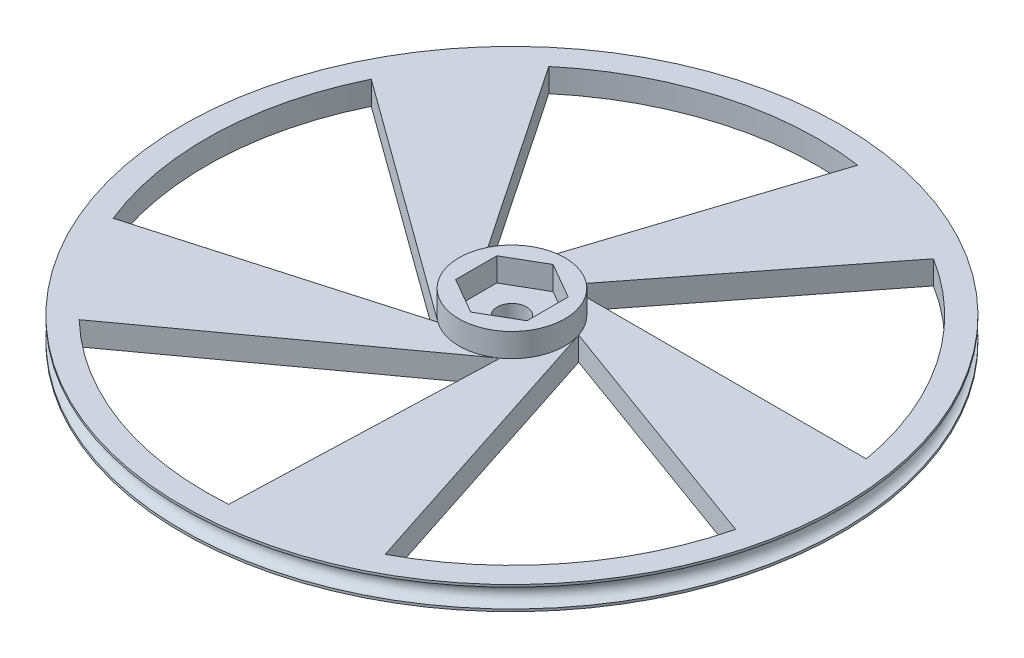
ISO-10303-21;
HEADER;
FILE_DESCRIPTION(('STEP AP214'),'2;1');
FILE_NAME('part.step','',(''),(''),'','','');
FILE_SCHEMA(('AUTOMOTIVE_DESIGN { 1 0 10303 214 1 1 1 1 }'));
ENDSEC;
DATA;
#1=APPLICATION_CONTEXT('core data for automotive mechanical design processes');
#2=APPLICATION_PROTOCOL_DEFINITION('international standard','automotive_design',2000,#1);
#3=PRODUCT_CONTEXT('',#1,'mechanical');
#4=PRODUCT('Part','Part','',(#3));
#5=PRODUCT_RELATED_PRODUCT_CATEGORY('part','',(#4));
#6=PRODUCT_DEFINITION_FORMATION('','',#4);
#7=PRODUCT_DEFINITION_CONTEXT('part definition',#1,'design');
#8=PRODUCT_DEFINITION('design','',#6,#7);
#9=PRODUCT_DEFINITION_SHAPE('','',#8);
#10=(LENGTH_UNIT() NAMED_UNIT(*) SI_UNIT(.MILLI.,.METRE.));
#11=(NAMED_UNIT(*) PLANE_ANGLE_UNIT() SI_UNIT($,.RADIAN.));
#12=(NAMED_UNIT(*) SI_UNIT($,.STERADIAN.) SOLID_ANGLE_UNIT());
#13=UNCERTAINTY_MEASURE_WITH_UNIT(LENGTH_MEASURE(1.E-05),#10,'distance_accuracy_value','');
#14=(GEOMETRIC_REPRESENTATION_CONTEXT(3) GLOBAL_UNCERTAINTY_ASSIGNED_CONTEXT((#13)) GLOBAL_UNIT_ASSIGNED_CONTEXT((#10,
#11,#12)) REPRESENTATION_CONTEXT('',''));
#15=CARTESIAN_POINT('',(0.,0.,0.));
#16=DIRECTION('',(0.,0.,1.));
#17=DIRECTION('',(1.,0.,0.));
#18=AXIS2_PLACEMENT_3D('',#15,#16,#17);
#19=CARTESIAN_POINT('',(0.,4.,0.));
#20=DIRECTION('',(0.,-1.,0.));
#21=DIRECTION('',(0.,0.,-1.));
#22=AXIS2_PLACEMENT_3D('',#19,#20,#21);
#23=CYLINDRICAL_SURFACE('',#22,2.5);
#24=CARTESIAN_POINT('',(0.,0.,0.));
#25=DIRECTION('',(0.,-1.,0.));
#26=DIRECTION('',(0.,0.,-1.));
#27=AXIS2_PLACEMENT_3D('',#24,#25,#26);
#28=CIRCLE('',#27,2.5);
#29=CARTESIAN_POINT('',(0.,0.,-2.5));
#30=VERTEX_POINT('',#29);
#31=EDGE_CURVE('E412',#30,#30,#28,.T.);
#32=ORIENTED_EDGE('',*,*,#31,.T.);
#33=EDGE_LOOP('',(#32));
#34=FACE_BOUND('',#33,.T.);
#35=CARTESIAN_POINT('',(0.,4.,0.));
#36=DIRECTION('',(0.,1.,0.));
#37=DIRECTION('',(0.,0.,1.));
#38=AXIS2_PLACEMENT_3D('',#35,#36,#37);
#39=CIRCLE('',#38,2.5);
#40=CARTESIAN_POINT('',(0.,4.,2.5));
#41=VERTEX_POINT('',#40);
#42=EDGE_CURVE('E93',#41,#41,#39,.T.);
#43=ORIENTED_EDGE('',*,*,#42,.T.);
#44=EDGE_LOOP('',(#43));
#45=FACE_BOUND('',#44,.T.);
#46=ADVANCED_FACE('F89',(#34,#45),#23,.F.);
#47=CARTESIAN_POINT('',(0.,2.,0.));
#48=DIRECTION('',(0.,-1.,0.));
#49=DIRECTION('',(0.,0.,-1.));
#50=AXIS2_PLACEMENT_3D('',#47,#48,#49);
#51=TOROIDAL_SURFACE('',#50,56.,1.6);
#52=CARTESIAN_POINT('',(0.,0.400000000000002,0.));
#53=DIRECTION('',(0.,-1.,0.));
#54=DIRECTION('',(0.,0.,-1.));
#55=AXIS2_PLACEMENT_3D('',#52,#53,#54);
#56=CIRCLE('',#55,56.);
#57=CARTESIAN_POINT('',(0.,0.400000000000002,-56.));
#58=VERTEX_POINT('',#57);
#59=EDGE_CURVE('E402',#58,#58,#56,.T.);
#60=ORIENTED_EDGE('',*,*,#59,.F.);
#61=EDGE_LOOP('',(#60));
#62=FACE_BOUND('',#61,.T.);
#63=CARTESIAN_POINT('',(0.,3.6,0.));
#64=DIRECTION('',(0.,-1.,0.));
#65=DIRECTION('',(0.,0.,-1.));
#66=AXIS2_PLACEMENT_3D('',#63,#64,#65);
#67=CIRCLE('',#66,56.);
#68=CARTESIAN_POINT('',(0.,3.6,-56.));
#69=VERTEX_POINT('',#68);
#70=EDGE_CURVE('E12',#69,#69,#67,.T.);
#71=ORIENTED_EDGE('',*,*,#70,.T.);
#72=EDGE_LOOP('',(#71));
#73=FACE_BOUND('',#72,.T.);
#74=ADVANCED_FACE('F91',(#62,#73),#51,.F.);
#75=CARTESIAN_POINT('',(0.,4.,0.));
#76=DIRECTION('',(0.,-1.,0.));
#77=DIRECTION('',(0.,0.,-1.));
#78=AXIS2_PLACEMENT_3D('',#75,#76,#77);
#79=CYLINDRICAL_SURFACE('',#78,56.);
#80=CARTESIAN_POINT('',(0.,4.,0.));
#81=DIRECTION('',(0.,-1.,0.));
#82=DIRECTION('',(0.,0.,-1.));
#83=AXIS2_PLACEMENT_3D('',#80,#81,#82);
#84=CIRCLE('',#83,56.);
#85=CARTESIAN_POINT('',(0.,4.,-56.));
#86=VERTEX_POINT('',#85);
#87=EDGE_CURVE('E98',#86,#86,#84,.T.);
#88=ORIENTED_EDGE('',*,*,#87,.T.);
#89=EDGE_LOOP('',(#88));
#90=FACE_BOUND('',#89,.T.);
#91=ORIENTED_EDGE('',*,*,#70,.F.);
#92=EDGE_LOOP('',(#91));
#93=FACE_BOUND('',#92,.T.);
#94=ADVANCED_FACE('F426',(#90,#93),#79,.T.);
#95=CARTESIAN_POINT('',(0.,4.,0.));
#96=DIRECTION('',(0.,-1.,0.));
#97=DIRECTION('',(0.,0.,-1.));
#98=AXIS2_PLACEMENT_3D('',#95,#96,#97);
#99=PLANE('',#98);
#100=CARTESIAN_POINT('',(0.,4.,0.));
#101=DIRECTION('',(0.,1.,0.));
#102=DIRECTION('',(0.,0.,1.));
#103=AXIS2_PLACEMENT_3D('',#100,#101,#102);
#104=CIRCLE('',#103,52.);
#105=CARTESIAN_POINT('',(51.2152321092075,4.,-9.));
#106=VERTEX_POINT('',#105);
#107=CARTESIAN_POINT('',(27.4657957441155,4.,-44.1546154342049));
#108=VERTEX_POINT('',#107);
#109=EDGE_CURVE('E299',#106,#108,#104,.T.);
#110=ORIENTED_EDGE('',*,*,#109,.F.);
#111=DIRECTION('',(1.,0.,0.));
#112=VECTOR('',#111,1.);
#113=CARTESIAN_POINT('',(0.,4.,-9.));
#114=LINE('',#113,#112);
#115=CARTESIAN_POINT('',(0.,4.,-9.));
#116=VERTEX_POINT('',#115);
#117=EDGE_CURVE('E113',#116,#106,#114,.T.);
#118=ORIENTED_EDGE('',*,*,#117,.F.);
#119=CARTESIAN_POINT('',(0.,4.,0.));
#120=DIRECTION('',(0.,-1.,0.));
#121=DIRECTION('',(0.,0.,-1.));
#122=AXIS2_PLACEMENT_3D('',#119,#120,#121);
#123=CIRCLE('',#122,9.);
#124=CARTESIAN_POINT('',(8.55950864665637,4.,-2.78115294937457));
#125=VERTEX_POINT('',#124);
#126=EDGE_CURVE('E418',#116,#125,#123,.T.);
#127=ORIENTED_EDGE('',*,*,#126,.T.);
#128=DIRECTION('',(0.939692620785908,0.,0.342020143325669));
#129=VECTOR('',#128,1.);
#130=CARTESIAN_POINT('',(1.89511763427878,4.,-5.20679290739121));
#131=LINE('',#130,#129);
#132=CARTESIAN_POINT('',(50.4809323821699,4.,12.4769974684131));
#133=VERTEX_POINT('',#132);
#134=EDGE_CURVE('E386',#125,#133,#131,.T.);
#135=ORIENTED_EDGE('',*,*,#134,.T.);
#136=CARTESIAN_POINT('',(0.,4.,0.));
#137=DIRECTION('',(0.,1.,0.));
#138=DIRECTION('',(0.,0.,1.));
#139=AXIS2_PLACEMENT_3D('',#136,#137,#138);
#140=CIRCLE('',#139,52.);
#141=CARTESIAN_POINT('',(24.3858857392589,4.,45.9274272816561));
#142=VERTEX_POINT('',#141);
#143=EDGE_CURVE('E394',#142,#133,#140,.T.);
#144=ORIENTED_EDGE('',*,*,#143,.F.);
#145=DIRECTION('',(0.309016994374945,0.,0.951056516295154));
#146=VECTOR('',#145,1.);
#147=CARTESIAN_POINT('',(8.55950864665638,4.,-2.7811529493745));
#148=LINE('',#147,#146);
#149=EDGE_CURVE('E377',#125,#142,#148,.T.);
#150=ORIENTED_EDGE('',*,*,#149,.F.);
#151=CARTESIAN_POINT('',(5.29006727063228,4.,7.28115294937451));
#152=VERTEX_POINT('',#151);
#153=EDGE_CURVE('E419',#125,#152,#123,.T.);
#154=ORIENTED_EDGE('',*,*,#153,.T.);
#155=DIRECTION('',(-0.0348994967025017,0.,0.999390827019096));
#156=VECTOR('',#155,1.);
#157=CARTESIAN_POINT('',(5.53757787890558,4.,0.193376480651867));
#158=LINE('',#157,#156);
#159=CARTESIAN_POINT('',(3.7331362518507,4.,51.8658239472306));
#160=VERTEX_POINT('',#159);
#161=EDGE_CURVE('E362',#152,#160,#158,.T.);
#162=ORIENTED_EDGE('',*,*,#161,.T.);
#163=CARTESIAN_POINT('',(0.,4.,0.));
#164=DIRECTION('',(0.,1.,0.));
#165=DIRECTION('',(0.,0.,1.));
#166=AXIS2_PLACEMENT_3D('',#163,#164,#165);
#167=CIRCLE('',#166,52.);
#168=CARTESIAN_POINT('',(-36.1439258765743,4.,37.3847110759024));
#169=VERTEX_POINT('',#168);
#170=EDGE_CURVE('E370',#169,#160,#167,.T.);
#171=ORIENTED_EDGE('',*,*,#170,.F.);
#172=DIRECTION('',(-0.80901699437495,0.,0.587785252292469));
#173=VECTOR('',#172,1.);
#174=CARTESIAN_POINT('',(5.2900672706322,4.,7.28115294937452));
#175=LINE('',#174,#173);
#176=EDGE_CURVE('E353',#152,#169,#175,.T.);
#177=ORIENTED_EDGE('',*,*,#176,.F.);
#178=CARTESIAN_POINT('',(-5.29006727063228,4.,7.28115294937451));
#179=VERTEX_POINT('',#178);
#180=EDGE_CURVE('E422',#152,#179,#123,.T.);
#181=ORIENTED_EDGE('',*,*,#180,.T.);
#182=DIRECTION('',(-0.961261695938319,0.,0.275637355816999));
#183=VECTOR('',#182,1.);
#184=CARTESIAN_POINT('',(1.52729371023441,4.,5.32630614505885));
#185=LINE('',#184,#183);
#186=CARTESIAN_POINT('',(-48.1737272938918,4.,19.5778445854936));
#187=VERTEX_POINT('',#186);
#188=EDGE_CURVE('E338',#179,#187,#185,.T.);
#189=ORIENTED_EDGE('',*,*,#188,.T.);
#190=CARTESIAN_POINT('',(0.,4.,0.));
#191=DIRECTION('',(0.,1.,0.));
#192=DIRECTION('',(0.,0.,1.));
#193=AXIS2_PLACEMENT_3D('',#190,#191,#192);
#194=CIRCLE('',#193,52.);
#195=CARTESIAN_POINT('',(-46.7240604178384,4.,-22.822405177154));
#196=VERTEX_POINT('',#195);
#197=EDGE_CURVE('E346',#196,#187,#194,.T.);
#198=ORIENTED_EDGE('',*,*,#197,.F.);
#199=DIRECTION('',(-0.809016994374943,0.,-0.58778525229248));
#200=VECTOR('',#199,1.);
#201=CARTESIAN_POINT('',(-5.29006727063228,4.,7.28115294937443));
#202=LINE('',#201,#200);
#203=EDGE_CURVE('E329',#179,#196,#202,.T.);
#204=ORIENTED_EDGE('',*,*,#203,.F.);
#205=CARTESIAN_POINT('',(-8.55950864665637,4.,-2.78115294937456));
#206=VERTEX_POINT('',#205);
#207=EDGE_CURVE('E749',#179,#206,#123,.T.);
#208=ORIENTED_EDGE('',*,*,#207,.T.);
#209=DIRECTION('',(-0.559192903470746,0.,-0.829037572555042));
#210=VECTOR('',#209,1.);
#211=CARTESIAN_POINT('',(-4.59365845517674,4.,3.09846175148193));
#212=LINE('',#211,#210);
#213=CARTESIAN_POINT('',(-33.5061370842443,4.,-39.7660505669325));
#214=VERTEX_POINT('',#213);
#215=EDGE_CURVE('E314',#206,#214,#212,.T.);
#216=ORIENTED_EDGE('',*,*,#215,.T.);
#217=CARTESIAN_POINT('',(0.,4.,0.));
#218=DIRECTION('',(0.,1.,0.));
#219=DIRECTION('',(0.,0.,1.));
#220=AXIS2_PLACEMENT_3D('',#217,#218,#219);
#221=CIRCLE('',#220,52.);
#222=CARTESIAN_POINT('',(7.26686844594681,4.,-51.489733180405));
#223=VERTEX_POINT('',#222);
#224=EDGE_CURVE('E322',#223,#214,#221,.T.);
#225=ORIENTED_EDGE('',*,*,#224,.F.);
#226=DIRECTION('',(0.309016994374958,0.,-0.95105651629515));
#227=VECTOR('',#226,1.);
#228=CARTESIAN_POINT('',(-8.55950864665635,4.,-2.78115294937462));
#229=LINE('',#228,#227);
#230=EDGE_CURVE('E306',#206,#223,#229,.T.);
#231=ORIENTED_EDGE('',*,*,#230,.F.);
#232=EDGE_CURVE('E748',#206,#116,#123,.T.);
#233=ORIENTED_EDGE('',*,*,#232,.T.);
#234=DIRECTION('',(0.615661475325659,0.,-0.788010753606722));
#235=VECTOR('',#234,1.);
#236=CARTESIAN_POINT('',(-4.36633076824198,4.,-3.4113514698015));
#237=LINE('',#236,#235);
#238=EDGE_CURVE('E291',#116,#108,#237,.T.);
#239=ORIENTED_EDGE('',*,*,#238,.T.);
#240=EDGE_LOOP('',(#110,#118,#127,#135,#144,#150,#154,#162,#171,#177,#181,#189,#198,#204,#208,
#216,#225,#231,#233,#239));
#241=FACE_BOUND('',#240,.T.);
#242=ORIENTED_EDGE('',*,*,#87,.F.);
#243=EDGE_LOOP('',(#242));
#244=FACE_BOUND('',#243,.T.);
#245=ADVANCED_FACE('F429',(#241,#244),#99,.F.);
#246=CARTESIAN_POINT('',(0.,4.,0.));
#247=DIRECTION('',(0.,-1.,0.));
#248=DIRECTION('',(0.,0.,-1.));
#249=AXIS2_PLACEMENT_3D('',#246,#247,#248);
#250=CYLINDRICAL_SURFACE('',#249,9.);
#251=ORIENTED_EDGE('',*,*,#153,.F.);
#252=ORIENTED_EDGE('',*,*,#126,.F.);
#253=ORIENTED_EDGE('',*,*,#232,.F.);
#254=ORIENTED_EDGE('',*,*,#207,.F.);
#255=ORIENTED_EDGE('',*,*,#180,.F.);
#256=EDGE_LOOP('',(#251,#252,#253,#254,#255));
#257=FACE_BOUND('',#256,.T.);
#258=CARTESIAN_POINT('',(0.,8.,0.));
#259=DIRECTION('',(0.,-1.,0.));
#260=DIRECTION('',(0.,0.,-1.));
#261=AXIS2_PLACEMENT_3D('',#258,#259,#260);
#262=CIRCLE('',#261,9.);
#263=CARTESIAN_POINT('',(0.,8.,-9.));
#264=VERTEX_POINT('',#263);
#265=EDGE_CURVE('E415',#264,#264,#262,.T.);
#266=ORIENTED_EDGE('',*,*,#265,.T.);
#267=EDGE_LOOP('',(#266));
#268=FACE_BOUND('',#267,.T.);
#269=ADVANCED_FACE('F431',(#257,#268),#250,.T.);
#270=CARTESIAN_POINT('',(0.,8.,0.));
#271=DIRECTION('',(0.,-1.,0.));
#272=DIRECTION('',(0.,0.,-1.));
#273=AXIS2_PLACEMENT_3D('',#270,#271,#272);
#274=PLANE('',#273);
#275=DIRECTION('',(-0.866025403784439,0.,0.5));
#276=VECTOR('',#275,1.);
#277=CARTESIAN_POINT('',(0.,8.,-7.));
#278=LINE('',#277,#276);
#279=CARTESIAN_POINT('',(0.,8.,-7.));
#280=VERTEX_POINT('',#279);
#281=CARTESIAN_POINT('',(-6.06217782649107,8.,-3.5));
#282=VERTEX_POINT('',#281);
#283=EDGE_CURVE('E268',#280,#282,#278,.T.);
#284=ORIENTED_EDGE('',*,*,#283,.F.);
#285=DIRECTION('',(-0.866025403784439,0.,-0.5));
#286=VECTOR('',#285,1.);
#287=CARTESIAN_POINT('',(6.06217782649107,8.,-3.50000000000001));
#288=LINE('',#287,#286);
#289=CARTESIAN_POINT('',(6.06217782649107,8.,-3.50000000000001));
#290=VERTEX_POINT('',#289);
#291=EDGE_CURVE('E105',#290,#280,#288,.T.);
#292=ORIENTED_EDGE('',*,*,#291,.F.);
#293=DIRECTION('',(0.,0.,-1.));
#294=VECTOR('',#293,1.);
#295=CARTESIAN_POINT('',(6.06217782649107,8.,3.5));
#296=LINE('',#295,#294);
#297=CARTESIAN_POINT('',(6.06217782649107,8.,3.5));
#298=VERTEX_POINT('',#297);
#299=EDGE_CURVE('E254',#298,#290,#296,.T.);
#300=ORIENTED_EDGE('',*,*,#299,.F.);
#301=DIRECTION('',(0.866025403784439,0.,-0.5));
#302=VECTOR('',#301,1.);
#303=CARTESIAN_POINT('',(0.,8.,7.));
#304=LINE('',#303,#302);
#305=CARTESIAN_POINT('',(0.,8.,7.));
#306=VERTEX_POINT('',#305);
#307=EDGE_CURVE('E257',#306,#298,#304,.T.);
#308=ORIENTED_EDGE('',*,*,#307,.F.);
#309=DIRECTION('',(0.866025403784439,0.,0.5));
#310=VECTOR('',#309,1.);
#311=CARTESIAN_POINT('',(-6.06217782649107,8.,3.5));
#312=LINE('',#311,#310);
#313=CARTESIAN_POINT('',(-6.06217782649107,8.,3.5));
#314=VERTEX_POINT('',#313);
#315=EDGE_CURVE('E273',#314,#306,#312,.T.);
#316=ORIENTED_EDGE('',*,*,#315,.F.);
#317=DIRECTION('',(0.,0.,1.));
#318=VECTOR('',#317,1.);
#319=CARTESIAN_POINT('',(-6.06217782649107,8.,-3.5));
#320=LINE('',#319,#318);
#321=EDGE_CURVE('E270',#282,#314,#320,.T.);
#322=ORIENTED_EDGE('',*,*,#321,.F.);
#323=EDGE_LOOP('',(#284,#292,#300,#308,#316,#322));
#324=FACE_BOUND('',#323,.T.);
#325=ORIENTED_EDGE('',*,*,#265,.F.);
#326=EDGE_LOOP('',(#325));
#327=FACE_BOUND('',#326,.T.);
#328=ADVANCED_FACE('F437',(#324,#327),#274,.F.);
#329=CARTESIAN_POINT('',(0.,0.,0.));
#330=DIRECTION('',(0.,-1.,0.));
#331=DIRECTION('',(0.,0.,-1.));
#332=AXIS2_PLACEMENT_3D('',#329,#330,#331);
#333=PLANE('',#332);
#334=DIRECTION('',(1.,0.,0.));
#335=VECTOR('',#334,1.);
#336=CARTESIAN_POINT('',(0.,0.,-9.));
#337=LINE('',#336,#335);
#338=CARTESIAN_POINT('',(0.,0.,-9.));
#339=VERTEX_POINT('',#338);
#340=CARTESIAN_POINT('',(51.2152321092075,0.,-9.));
#341=VERTEX_POINT('',#340);
#342=EDGE_CURVE('E287',#339,#341,#337,.T.);
#343=ORIENTED_EDGE('',*,*,#342,.T.);
#344=CARTESIAN_POINT('',(0.,0.,0.));
#345=DIRECTION('',(0.,1.,0.));
#346=DIRECTION('',(0.,0.,1.));
#347=AXIS2_PLACEMENT_3D('',#344,#345,#346);
#348=CIRCLE('',#347,52.);
#349=CARTESIAN_POINT('',(27.4657957441155,0.,-44.1546154342049));
#350=VERTEX_POINT('',#349);
#351=EDGE_CURVE('E290',#341,#350,#348,.T.);
#352=ORIENTED_EDGE('',*,*,#351,.T.);
#353=DIRECTION('',(0.615661475325659,0.,-0.788010753606722));
#354=VECTOR('',#353,1.);
#355=CARTESIAN_POINT('',(-4.36633076824198,0.,-3.4113514698015));
#356=LINE('',#355,#354);
#357=EDGE_CURVE('E294',#339,#350,#356,.T.);
#358=ORIENTED_EDGE('',*,*,#357,.F.);
#359=EDGE_LOOP('',(#343,#352,#358));
#360=FACE_BOUND('',#359,.T.);
#361=DIRECTION('',(0.309016994374958,0.,-0.95105651629515));
#362=VECTOR('',#361,1.);
#363=CARTESIAN_POINT('',(-8.55950864665635,0.,-2.78115294937462));
#364=LINE('',#363,#362);
#365=CARTESIAN_POINT('',(-8.55950864665637,0.,-2.78115294937456));
#366=VERTEX_POINT('',#365);
#367=CARTESIAN_POINT('',(7.26686844594681,0.,-51.489733180405));
#368=VERTEX_POINT('',#367);
#369=EDGE_CURVE('E310',#366,#368,#364,.T.);
#370=ORIENTED_EDGE('',*,*,#369,.T.);
#371=CARTESIAN_POINT('',(0.,0.,0.));
#372=DIRECTION('',(0.,1.,0.));
#373=DIRECTION('',(0.,0.,1.));
#374=AXIS2_PLACEMENT_3D('',#371,#372,#373);
#375=CIRCLE('',#374,52.);
#376=CARTESIAN_POINT('',(-33.5061370842443,0.,-39.7660505669325));
#377=VERTEX_POINT('',#376);
#378=EDGE_CURVE('E313',#368,#377,#375,.T.);
#379=ORIENTED_EDGE('',*,*,#378,.T.);
#380=DIRECTION('',(-0.559192903470746,0.,-0.829037572555042));
#381=VECTOR('',#380,1.);
#382=CARTESIAN_POINT('',(-4.59365845517674,0.,3.09846175148193));
#383=LINE('',#382,#381);
#384=EDGE_CURVE('E317',#366,#377,#383,.T.);
#385=ORIENTED_EDGE('',*,*,#384,.F.);
#386=EDGE_LOOP('',(#370,#379,#385));
#387=FACE_BOUND('',#386,.T.);
#388=DIRECTION('',(-0.809016994374943,0.,-0.58778525229248));
#389=VECTOR('',#388,1.);
#390=CARTESIAN_POINT('',(-5.29006727063228,0.,7.28115294937443));
#391=LINE('',#390,#389);
#392=CARTESIAN_POINT('',(-5.29006727063228,0.,7.28115294937451));
#393=VERTEX_POINT('',#392);
#394=CARTESIAN_POINT('',(-46.7240604178384,0.,-22.822405177154));
#395=VERTEX_POINT('',#394);
#396=EDGE_CURVE('E334',#393,#395,#391,.T.);
#397=ORIENTED_EDGE('',*,*,#396,.T.);
#398=CARTESIAN_POINT('',(0.,0.,0.));
#399=DIRECTION('',(0.,1.,0.));
#400=DIRECTION('',(0.,0.,1.));
#401=AXIS2_PLACEMENT_3D('',#398,#399,#400);
#402=CIRCLE('',#401,52.);
#403=CARTESIAN_POINT('',(-48.1737272938918,0.,19.5778445854936));
#404=VERTEX_POINT('',#403);
#405=EDGE_CURVE('E337',#395,#404,#402,.T.);
#406=ORIENTED_EDGE('',*,*,#405,.T.);
#407=DIRECTION('',(-0.961261695938319,0.,0.275637355816999));
#408=VECTOR('',#407,1.);
#409=CARTESIAN_POINT('',(1.52729371023441,0.,5.32630614505885));
#410=LINE('',#409,#408);
#411=EDGE_CURVE('E341',#393,#404,#410,.T.);
#412=ORIENTED_EDGE('',*,*,#411,.F.);
#413=EDGE_LOOP('',(#397,#406,#412));
#414=FACE_BOUND('',#413,.T.);
#415=DIRECTION('',(-0.80901699437495,0.,0.587785252292469));
#416=VECTOR('',#415,1.);
#417=CARTESIAN_POINT('',(5.2900672706322,0.,7.28115294937452));
#418=LINE('',#417,#416);
#419=CARTESIAN_POINT('',(5.29006727063228,0.,7.28115294937451));
#420=VERTEX_POINT('',#419);
#421=CARTESIAN_POINT('',(-36.1439258765743,0.,37.3847110759024));
#422=VERTEX_POINT('',#421);
#423=EDGE_CURVE('E358',#420,#422,#418,.T.);
#424=ORIENTED_EDGE('',*,*,#423,.T.);
#425=CARTESIAN_POINT('',(0.,0.,0.));
#426=DIRECTION('',(0.,1.,0.));
#427=DIRECTION('',(0.,0.,1.));
#428=AXIS2_PLACEMENT_3D('',#425,#426,#427);
#429=CIRCLE('',#428,52.);
#430=CARTESIAN_POINT('',(3.7331362518507,0.,51.8658239472306));
#431=VERTEX_POINT('',#430);
#432=EDGE_CURVE('E361',#422,#431,#429,.T.);
#433=ORIENTED_EDGE('',*,*,#432,.T.);
#434=DIRECTION('',(-0.0348994967025017,0.,0.999390827019096));
#435=VECTOR('',#434,1.);
#436=CARTESIAN_POINT('',(5.53757787890558,0.,0.193376480651867));
#437=LINE('',#436,#435);
#438=EDGE_CURVE('E365',#420,#431,#437,.T.);
#439=ORIENTED_EDGE('',*,*,#438,.F.);
#440=EDGE_LOOP('',(#424,#433,#439));
#441=FACE_BOUND('',#440,.T.);
#442=DIRECTION('',(0.309016994374945,0.,0.951056516295154));
#443=VECTOR('',#442,1.);
#444=CARTESIAN_POINT('',(8.55950864665638,0.,-2.7811529493745));
#445=LINE('',#444,#443);
#446=CARTESIAN_POINT('',(8.55950864665637,0.,-2.78115294937457));
#447=VERTEX_POINT('',#446);
#448=CARTESIAN_POINT('',(24.3858857392589,0.,45.9274272816561));
#449=VERTEX_POINT('',#448);
#450=EDGE_CURVE('E382',#447,#449,#445,.T.);
#451=ORIENTED_EDGE('',*,*,#450,.T.);
#452=CARTESIAN_POINT('',(0.,0.,0.));
#453=DIRECTION('',(0.,1.,0.));
#454=DIRECTION('',(0.,0.,1.));
#455=AXIS2_PLACEMENT_3D('',#452,#453,#454);
#456=CIRCLE('',#455,52.);
#457=CARTESIAN_POINT('',(50.4809323821699,0.,12.4769974684131));
#458=VERTEX_POINT('',#457);
#459=EDGE_CURVE('E385',#449,#458,#456,.T.);
#460=ORIENTED_EDGE('',*,*,#459,.T.);
#461=DIRECTION('',(0.939692620785908,0.,0.342020143325669));
#462=VECTOR('',#461,1.);
#463=CARTESIAN_POINT('',(1.89511763427878,0.,-5.20679290739121));
#464=LINE('',#463,#462);
#465=EDGE_CURVE('E389',#447,#458,#464,.T.);
#466=ORIENTED_EDGE('',*,*,#465,.F.);
#467=EDGE_LOOP('',(#451,#460,#466));
#468=FACE_BOUND('',#467,.T.);
#469=CARTESIAN_POINT('',(0.,0.,0.));
#470=DIRECTION('',(0.,-1.,0.));
#471=DIRECTION('',(0.,0.,-1.));
#472=AXIS2_PLACEMENT_3D('',#469,#470,#471);
#473=CIRCLE('',#472,56.);
#474=CARTESIAN_POINT('',(0.,0.,-56.));
#475=VERTEX_POINT('',#474);
#476=EDGE_CURVE('E409',#475,#475,#473,.T.);
#477=ORIENTED_EDGE('',*,*,#476,.T.);
#478=EDGE_LOOP('',(#477));
#479=FACE_BOUND('',#478,.T.);
#480=ORIENTED_EDGE('',*,*,#31,.F.);
#481=EDGE_LOOP('',(#480));
#482=FACE_BOUND('',#481,.T.);
#483=ADVANCED_FACE('F453',(#360,#387,#414,#441,#468,#479,#482),#333,.T.);
#484=ORIENTED_EDGE('',*,*,#59,.T.);
#485=EDGE_LOOP('',(#484));
#486=FACE_BOUND('',#485,.T.);
#487=ORIENTED_EDGE('',*,*,#476,.F.);
#488=EDGE_LOOP('',(#487));
#489=FACE_BOUND('',#488,.T.);
#490=ADVANCED_FACE('F441',(#486,#489),#79,.T.);
#491=CARTESIAN_POINT('',(8.55950864665638,0.,-2.7811529493745));
#492=DIRECTION('',(-0.951056516295154,0.,0.309016994374945));
#493=DIRECTION('',(0.309016994374945,0.,0.951056516295154));
#494=AXIS2_PLACEMENT_3D('',#491,#492,#493);
#495=PLANE('',#494);
#496=ORIENTED_EDGE('',*,*,#149,.T.);
#497=DIRECTION('',(0.,1.,0.));
#498=VECTOR('',#497,1.);
#499=CARTESIAN_POINT('',(24.3858857392589,0.,45.9274272816561));
#500=LINE('',#499,#498);
#501=EDGE_CURVE('E392',#449,#142,#500,.T.);
#502=ORIENTED_EDGE('',*,*,#501,.F.);
#503=ORIENTED_EDGE('',*,*,#450,.F.);
#504=DIRECTION('',(0.,1.,0.));
#505=VECTOR('',#504,1.);
#506=CARTESIAN_POINT('',(8.55950864665637,0.,-2.78115294937457));
#507=LINE('',#506,#505);
#508=EDGE_CURVE('E399',#447,#125,#507,.T.);
#509=ORIENTED_EDGE('',*,*,#508,.T.);
#510=EDGE_LOOP('',(#496,#502,#503,#509));
#511=FACE_BOUND('',#510,.T.);
#512=ADVANCED_FACE('F544',(#511),#495,.F.);
#513=CARTESIAN_POINT('',(1.89511763427878,0.,-5.20679290739121));
#514=DIRECTION('',(-0.342020143325669,0.,0.939692620785908));
#515=DIRECTION('',(0.939692620785908,0.,0.342020143325669));
#516=AXIS2_PLACEMENT_3D('',#513,#514,#515);
#517=PLANE('',#516);
#518=ORIENTED_EDGE('',*,*,#134,.F.);
#519=ORIENTED_EDGE('',*,*,#508,.F.);
#520=ORIENTED_EDGE('',*,*,#465,.T.);
#521=DIRECTION('',(0.,1.,0.));
#522=VECTOR('',#521,1.);
#523=CARTESIAN_POINT('',(50.4809323821699,0.,12.4769974684131));
#524=LINE('',#523,#522);
#525=EDGE_CURVE('E403',#458,#133,#524,.T.);
#526=ORIENTED_EDGE('',*,*,#525,.T.);
#527=EDGE_LOOP('',(#518,#519,#520,#526));
#528=FACE_BOUND('',#527,.T.);
#529=ADVANCED_FACE('F541',(#528),#517,.T.);
#530=CARTESIAN_POINT('',(0.,0.,0.));
#531=DIRECTION('',(0.,1.,0.));
#532=DIRECTION('',(0.,0.,1.));
#533=AXIS2_PLACEMENT_3D('',#530,#531,#532);
#534=CYLINDRICAL_SURFACE('',#533,52.);
#535=ORIENTED_EDGE('',*,*,#143,.T.);
#536=ORIENTED_EDGE('',*,*,#525,.F.);
#537=ORIENTED_EDGE('',*,*,#459,.F.);
#538=ORIENTED_EDGE('',*,*,#501,.T.);
#539=EDGE_LOOP('',(#535,#536,#537,#538));
#540=FACE_BOUND('',#539,.T.);
#541=ADVANCED_FACE('F539',(#540),#534,.F.);
#542=CARTESIAN_POINT('',(5.2900672706322,0.,7.28115294937452));
#543=DIRECTION('',(-0.587785252292469,0.,-0.80901699437495));
#544=DIRECTION('',(-0.80901699437495,0.,0.587785252292469));
#545=AXIS2_PLACEMENT_3D('',#542,#543,#544);
#546=PLANE('',#545);
#547=ORIENTED_EDGE('',*,*,#176,.T.);
#548=DIRECTION('',(0.,1.,0.));
#549=VECTOR('',#548,1.);
#550=CARTESIAN_POINT('',(-36.1439258765743,0.,37.3847110759024));
#551=LINE('',#550,#549);
#552=EDGE_CURVE('E368',#422,#169,#551,.T.);
#553=ORIENTED_EDGE('',*,*,#552,.F.);
#554=ORIENTED_EDGE('',*,*,#423,.F.);
#555=DIRECTION('',(0.,1.,0.));
#556=VECTOR('',#555,1.);
#557=CARTESIAN_POINT('',(5.29006727063228,0.,7.28115294937451));
#558=LINE('',#557,#556);
#559=EDGE_CURVE('E375',#420,#152,#558,.T.);
#560=ORIENTED_EDGE('',*,*,#559,.T.);
#561=EDGE_LOOP('',(#547,#553,#554,#560));
#562=FACE_BOUND('',#561,.T.);
#563=ADVANCED_FACE('F532',(#562),#546,.F.);
#564=CARTESIAN_POINT('',(5.53757787890558,0.,0.193376480651867));
#565=DIRECTION('',(-0.999390827019096,0.,-0.0348994967025017));
#566=DIRECTION('',(-0.0348994967025017,0.,0.999390827019096));
#567=AXIS2_PLACEMENT_3D('',#564,#565,#566);
#568=PLANE('',#567);
#569=ORIENTED_EDGE('',*,*,#161,.F.);
#570=ORIENTED_EDGE('',*,*,#559,.F.);
#571=ORIENTED_EDGE('',*,*,#438,.T.);
#572=DIRECTION('',(0.,1.,0.));
#573=VECTOR('',#572,1.);
#574=CARTESIAN_POINT('',(3.7331362518507,0.,51.8658239472306));
#575=LINE('',#574,#573);
#576=EDGE_CURVE('E378',#431,#160,#575,.T.);
#577=ORIENTED_EDGE('',*,*,#576,.T.);
#578=EDGE_LOOP('',(#569,#570,#571,#577));
#579=FACE_BOUND('',#578,.T.);
#580=ADVANCED_FACE('F529',(#579),#568,.T.);
#581=CARTESIAN_POINT('',(0.,0.,0.));
#582=DIRECTION('',(0.,1.,0.));
#583=DIRECTION('',(0.,0.,1.));
#584=AXIS2_PLACEMENT_3D('',#581,#582,#583);
#585=CYLINDRICAL_SURFACE('',#584,52.);
#586=ORIENTED_EDGE('',*,*,#170,.T.);
#587=ORIENTED_EDGE('',*,*,#576,.F.);
#588=ORIENTED_EDGE('',*,*,#432,.F.);
#589=ORIENTED_EDGE('',*,*,#552,.T.);
#590=EDGE_LOOP('',(#586,#587,#588,#589));
#591=FACE_BOUND('',#590,.T.);
#592=ADVANCED_FACE('F527',(#591),#585,.F.);
#593=CARTESIAN_POINT('',(-5.29006727063228,0.,7.28115294937443));
#594=DIRECTION('',(0.58778525229248,0.,-0.809016994374943));
#595=DIRECTION('',(-0.809016994374943,0.,-0.58778525229248));
#596=AXIS2_PLACEMENT_3D('',#593,#594,#595);
#597=PLANE('',#596);
#598=ORIENTED_EDGE('',*,*,#203,.T.);
#599=DIRECTION('',(0.,1.,0.));
#600=VECTOR('',#599,1.);
#601=CARTESIAN_POINT('',(-46.7240604178384,0.,-22.822405177154));
#602=LINE('',#601,#600);
#603=EDGE_CURVE('E344',#395,#196,#602,.T.);
#604=ORIENTED_EDGE('',*,*,#603,.F.);
#605=ORIENTED_EDGE('',*,*,#396,.F.);
#606=DIRECTION('',(0.,1.,0.));
#607=VECTOR('',#606,1.);
#608=CARTESIAN_POINT('',(-5.29006727063228,0.,7.28115294937451));
#609=LINE('',#608,#607);
#610=EDGE_CURVE('E351',#393,#179,#609,.T.);
#611=ORIENTED_EDGE('',*,*,#610,.T.);
#612=EDGE_LOOP('',(#598,#604,#605,#611));
#613=FACE_BOUND('',#612,.T.);
#614=ADVANCED_FACE('F520',(#613),#597,.F.);
#615=CARTESIAN_POINT('',(1.52729371023441,0.,5.32630614505885));
#616=DIRECTION('',(-0.275637355816999,0.,-0.961261695938319));
#617=DIRECTION('',(-0.961261695938319,0.,0.275637355816999));
#618=AXIS2_PLACEMENT_3D('',#615,#616,#617);
#619=PLANE('',#618);
#620=ORIENTED_EDGE('',*,*,#188,.F.);
#621=ORIENTED_EDGE('',*,*,#610,.F.);
#622=ORIENTED_EDGE('',*,*,#411,.T.);
#623=DIRECTION('',(0.,1.,0.));
#624=VECTOR('',#623,1.);
#625=CARTESIAN_POINT('',(-48.1737272938918,0.,19.5778445854936));
#626=LINE('',#625,#624);
#627=EDGE_CURVE('E354',#404,#187,#626,.T.);
#628=ORIENTED_EDGE('',*,*,#627,.T.);
#629=EDGE_LOOP('',(#620,#621,#622,#628));
#630=FACE_BOUND('',#629,.T.);
#631=ADVANCED_FACE('F517',(#630),#619,.T.);
#632=CARTESIAN_POINT('',(0.,0.,0.));
#633=DIRECTION('',(0.,1.,0.));
#634=DIRECTION('',(0.,0.,1.));
#635=AXIS2_PLACEMENT_3D('',#632,#633,#634);
#636=CYLINDRICAL_SURFACE('',#635,52.);
#637=ORIENTED_EDGE('',*,*,#197,.T.);
#638=ORIENTED_EDGE('',*,*,#627,.F.);
#639=ORIENTED_EDGE('',*,*,#405,.F.);
#640=ORIENTED_EDGE('',*,*,#603,.T.);
#641=EDGE_LOOP('',(#637,#638,#639,#640));
#642=FACE_BOUND('',#641,.T.);
#643=ADVANCED_FACE('F515',(#642),#636,.F.);
#644=CARTESIAN_POINT('',(-8.55950864665635,0.,-2.78115294937462));
#645=DIRECTION('',(0.95105651629515,0.,0.309016994374958));
#646=DIRECTION('',(0.309016994374958,0.,-0.95105651629515));
#647=AXIS2_PLACEMENT_3D('',#644,#645,#646);
#648=PLANE('',#647);
#649=ORIENTED_EDGE('',*,*,#230,.T.);
#650=DIRECTION('',(0.,1.,0.));
#651=VECTOR('',#650,1.);
#652=CARTESIAN_POINT('',(7.26686844594681,0.,-51.489733180405));
#653=LINE('',#652,#651);
#654=EDGE_CURVE('E320',#368,#223,#653,.T.);
#655=ORIENTED_EDGE('',*,*,#654,.F.);
#656=ORIENTED_EDGE('',*,*,#369,.F.);
#657=DIRECTION('',(0.,1.,0.));
#658=VECTOR('',#657,1.);
#659=CARTESIAN_POINT('',(-8.55950864665637,0.,-2.78115294937456));
#660=LINE('',#659,#658);
#661=EDGE_CURVE('E327',#366,#206,#660,.T.);
#662=ORIENTED_EDGE('',*,*,#661,.T.);
#663=EDGE_LOOP('',(#649,#655,#656,#662));
#664=FACE_BOUND('',#663,.T.);
#665=ADVANCED_FACE('F508',(#664),#648,.F.);
#666=CARTESIAN_POINT('',(-4.59365845517674,0.,3.09846175148193));
#667=DIRECTION('',(0.829037572555042,0.,-0.559192903470746));
#668=DIRECTION('',(-0.559192903470746,0.,-0.829037572555042));
#669=AXIS2_PLACEMENT_3D('',#666,#667,#668);
#670=PLANE('',#669);
#671=ORIENTED_EDGE('',*,*,#215,.F.);
#672=ORIENTED_EDGE('',*,*,#661,.F.);
#673=ORIENTED_EDGE('',*,*,#384,.T.);
#674=DIRECTION('',(0.,1.,0.));
#675=VECTOR('',#674,1.);
#676=CARTESIAN_POINT('',(-33.5061370842443,0.,-39.7660505669325));
#677=LINE('',#676,#675);
#678=EDGE_CURVE('E330',#377,#214,#677,.T.);
#679=ORIENTED_EDGE('',*,*,#678,.T.);
#680=EDGE_LOOP('',(#671,#672,#673,#679));
#681=FACE_BOUND('',#680,.T.);
#682=ADVANCED_FACE('F505',(#681),#670,.T.);
#683=CARTESIAN_POINT('',(0.,0.,0.));
#684=DIRECTION('',(0.,1.,0.));
#685=DIRECTION('',(0.,0.,1.));
#686=AXIS2_PLACEMENT_3D('',#683,#684,#685);
#687=CYLINDRICAL_SURFACE('',#686,52.);
#688=ORIENTED_EDGE('',*,*,#224,.T.);
#689=ORIENTED_EDGE('',*,*,#678,.F.);
#690=ORIENTED_EDGE('',*,*,#378,.F.);
#691=ORIENTED_EDGE('',*,*,#654,.T.);
#692=EDGE_LOOP('',(#688,#689,#690,#691));
#693=FACE_BOUND('',#692,.T.);
#694=ADVANCED_FACE('F504',(#693),#687,.F.);
#695=CARTESIAN_POINT('',(0.,0.,-9.));
#696=DIRECTION('',(0.,0.,1.));
#697=DIRECTION('',(1.,0.,0.));
#698=AXIS2_PLACEMENT_3D('',#695,#696,#697);
#699=PLANE('',#698);
#700=ORIENTED_EDGE('',*,*,#117,.T.);
#701=DIRECTION('',(0.,1.,0.));
#702=VECTOR('',#701,1.);
#703=CARTESIAN_POINT('',(51.2152321092075,0.,-9.));
#704=LINE('',#703,#702);
#705=EDGE_CURVE('E297',#341,#106,#704,.T.);
#706=ORIENTED_EDGE('',*,*,#705,.F.);
#707=ORIENTED_EDGE('',*,*,#342,.F.);
#708=DIRECTION('',(0.,1.,0.));
#709=VECTOR('',#708,1.);
#710=CARTESIAN_POINT('',(0.,0.,-9.));
#711=LINE('',#710,#709);
#712=EDGE_CURVE('E304',#339,#116,#711,.T.);
#713=ORIENTED_EDGE('',*,*,#712,.T.);
#714=EDGE_LOOP('',(#700,#706,#707,#713));
#715=FACE_BOUND('',#714,.T.);
#716=ADVANCED_FACE('F497',(#715),#699,.F.);
#717=CARTESIAN_POINT('',(-4.36633076824198,0.,-3.4113514698015));
#718=DIRECTION('',(0.788010753606722,0.,0.615661475325659));
#719=DIRECTION('',(0.615661475325659,0.,-0.788010753606722));
#720=AXIS2_PLACEMENT_3D('',#717,#718,#719);
#721=PLANE('',#720);
#722=ORIENTED_EDGE('',*,*,#238,.F.);
#723=ORIENTED_EDGE('',*,*,#712,.F.);
#724=ORIENTED_EDGE('',*,*,#357,.T.);
#725=DIRECTION('',(0.,1.,0.));
#726=VECTOR('',#725,1.);
#727=CARTESIAN_POINT('',(27.4657957441155,0.,-44.1546154342049));
#728=LINE('',#727,#726);
#729=EDGE_CURVE('E307',#350,#108,#728,.T.);
#730=ORIENTED_EDGE('',*,*,#729,.T.);
#731=EDGE_LOOP('',(#722,#723,#724,#730));
#732=FACE_BOUND('',#731,.T.);
#733=ADVANCED_FACE('F494',(#732),#721,.T.);
#734=CARTESIAN_POINT('',(0.,0.,0.));
#735=DIRECTION('',(0.,1.,0.));
#736=DIRECTION('',(0.,0.,1.));
#737=AXIS2_PLACEMENT_3D('',#734,#735,#736);
#738=CYLINDRICAL_SURFACE('',#737,52.);
#739=ORIENTED_EDGE('',*,*,#109,.T.);
#740=ORIENTED_EDGE('',*,*,#729,.F.);
#741=ORIENTED_EDGE('',*,*,#351,.F.);
#742=ORIENTED_EDGE('',*,*,#705,.T.);
#743=EDGE_LOOP('',(#739,#740,#741,#742));
#744=FACE_BOUND('',#743,.T.);
#745=ADVANCED_FACE('F484',(#744),#738,.F.);
#746=CARTESIAN_POINT('',(6.06217782649107,4.,-3.50000000000001));
#747=DIRECTION('',(0.499999999999999,0.,-0.866025403784439));
#748=DIRECTION('',(-0.866025403784439,0.,-0.5));
#749=AXIS2_PLACEMENT_3D('',#746,#747,#748);
#750=PLANE('',#749);
#751=ORIENTED_EDGE('',*,*,#291,.T.);
#752=DIRECTION('',(0.,1.,0.));
#753=VECTOR('',#752,1.);
#754=CARTESIAN_POINT('',(0.,4.,-7.));
#755=LINE('',#754,#753);
#756=CARTESIAN_POINT('',(0.,4.,-7.));
#757=VERTEX_POINT('',#756);
#758=EDGE_CURVE('E231',#757,#280,#755,.T.);
#759=ORIENTED_EDGE('',*,*,#758,.F.);
#760=DIRECTION('',(-0.866025403784439,0.,-0.5));
#761=VECTOR('',#760,1.);
#762=CARTESIAN_POINT('',(6.06217782649107,4.,-3.50000000000001));
#763=LINE('',#762,#761);
#764=CARTESIAN_POINT('',(6.06217782649107,4.,-3.50000000000001));
#765=VERTEX_POINT('',#764);
#766=EDGE_CURVE('E235',#765,#757,#763,.T.);
#767=ORIENTED_EDGE('',*,*,#766,.F.);
#768=DIRECTION('',(0.,1.,0.));
#769=VECTOR('',#768,1.);
#770=CARTESIAN_POINT('',(6.06217782649107,4.,-3.50000000000001));
#771=LINE('',#770,#769);
#772=EDGE_CURVE('E278',#765,#290,#771,.T.);
#773=ORIENTED_EDGE('',*,*,#772,.T.);
#774=EDGE_LOOP('',(#751,#759,#767,#773));
#775=FACE_BOUND('',#774,.T.);
#776=ADVANCED_FACE('F233',(#775),#750,.F.);
#777=CARTESIAN_POINT('',(6.06217782649107,4.,3.5));
#778=DIRECTION('',(1.,0.,0.));
#779=DIRECTION('',(0.,0.,-1.));
#780=AXIS2_PLACEMENT_3D('',#777,#778,#779);
#781=PLANE('',#780);
#782=ORIENTED_EDGE('',*,*,#299,.T.);
#783=ORIENTED_EDGE('',*,*,#772,.F.);
#784=DIRECTION('',(0.,0.,-1.));
#785=VECTOR('',#784,1.);
#786=CARTESIAN_POINT('',(6.06217782649107,4.,3.5));
#787=LINE('',#786,#785);
#788=CARTESIAN_POINT('',(6.06217782649107,4.,3.5));
#789=VERTEX_POINT('',#788);
#790=EDGE_CURVE('E241',#789,#765,#787,.T.);
#791=ORIENTED_EDGE('',*,*,#790,.F.);
#792=DIRECTION('',(0.,1.,0.));
#793=VECTOR('',#792,1.);
#794=CARTESIAN_POINT('',(6.06217782649107,4.,3.5));
#795=LINE('',#794,#793);
#796=EDGE_CURVE('E280',#789,#298,#795,.T.);
#797=ORIENTED_EDGE('',*,*,#796,.T.);
#798=EDGE_LOOP('',(#782,#783,#791,#797));
#799=FACE_BOUND('',#798,.T.);
#800=ADVANCED_FACE('F476',(#799),#781,.F.);
#801=CARTESIAN_POINT('',(0.,4.,7.));
#802=DIRECTION('',(0.5,0.,0.866025403784439));
#803=DIRECTION('',(0.866025403784439,0.,-0.5));
#804=AXIS2_PLACEMENT_3D('',#801,#802,#803);
#805=PLANE('',#804);
#806=ORIENTED_EDGE('',*,*,#307,.T.);
#807=ORIENTED_EDGE('',*,*,#796,.F.);
#808=DIRECTION('',(0.866025403784439,0.,-0.5));
#809=VECTOR('',#808,1.);
#810=CARTESIAN_POINT('',(0.,4.,7.));
#811=LINE('',#810,#809);
#812=CARTESIAN_POINT('',(0.,4.,7.));
#813=VERTEX_POINT('',#812);
#814=EDGE_CURVE('E264',#813,#789,#811,.T.);
#815=ORIENTED_EDGE('',*,*,#814,.F.);
#816=DIRECTION('',(0.,1.,0.));
#817=VECTOR('',#816,1.);
#818=CARTESIAN_POINT('',(0.,4.,7.));
#819=LINE('',#818,#817);
#820=EDGE_CURVE('E282',#813,#306,#819,.T.);
#821=ORIENTED_EDGE('',*,*,#820,.T.);
#822=EDGE_LOOP('',(#806,#807,#815,#821));
#823=FACE_BOUND('',#822,.T.);
#824=ADVANCED_FACE('F474',(#823),#805,.F.);
#825=CARTESIAN_POINT('',(-6.06217782649107,4.,3.5));
#826=DIRECTION('',(-0.5,0.,0.866025403784439));
#827=DIRECTION('',(0.866025403784439,0.,0.5));
#828=AXIS2_PLACEMENT_3D('',#825,#826,#827);
#829=PLANE('',#828);
#830=ORIENTED_EDGE('',*,*,#315,.T.);
#831=ORIENTED_EDGE('',*,*,#820,.F.);
#832=DIRECTION('',(0.866025403784439,0.,0.5));
#833=VECTOR('',#832,1.);
#834=CARTESIAN_POINT('',(-6.06217782649107,4.,3.5));
#835=LINE('',#834,#833);
#836=CARTESIAN_POINT('',(-6.06217782649107,4.,3.5));
#837=VERTEX_POINT('',#836);
#838=EDGE_CURVE('E261',#837,#813,#835,.T.);
#839=ORIENTED_EDGE('',*,*,#838,.F.);
#840=DIRECTION('',(0.,1.,0.));
#841=VECTOR('',#840,1.);
#842=CARTESIAN_POINT('',(-6.06217782649107,4.,3.5));
#843=LINE('',#842,#841);
#844=EDGE_CURVE('E284',#837,#314,#843,.T.);
#845=ORIENTED_EDGE('',*,*,#844,.T.);
#846=EDGE_LOOP('',(#830,#831,#839,#845));
#847=FACE_BOUND('',#846,.T.);
#848=ADVANCED_FACE('F472',(#847),#829,.F.);
#849=CARTESIAN_POINT('',(-6.06217782649107,4.,-3.5));
#850=DIRECTION('',(-1.,0.,0.));
#851=DIRECTION('',(0.,0.,1.));
#852=AXIS2_PLACEMENT_3D('',#849,#850,#851);
#853=PLANE('',#852);
#854=ORIENTED_EDGE('',*,*,#321,.T.);
#855=ORIENTED_EDGE('',*,*,#844,.F.);
#856=DIRECTION('',(0.,0.,1.));
#857=VECTOR('',#856,1.);
#858=CARTESIAN_POINT('',(-6.06217782649107,4.,-3.5));
#859=LINE('',#858,#857);
#860=CARTESIAN_POINT('',(-6.06217782649107,4.,-3.5));
#861=VERTEX_POINT('',#860);
#862=EDGE_CURVE('E249',#861,#837,#859,.T.);
#863=ORIENTED_EDGE('',*,*,#862,.F.);
#864=DIRECTION('',(0.,1.,0.));
#865=VECTOR('',#864,1.);
#866=CARTESIAN_POINT('',(-6.06217782649107,4.,-3.5));
#867=LINE('',#866,#865);
#868=EDGE_CURVE('E240',#861,#282,#867,.T.);
#869=ORIENTED_EDGE('',*,*,#868,.T.);
#870=EDGE_LOOP('',(#854,#855,#863,#869));
#871=FACE_BOUND('',#870,.T.);
#872=ADVANCED_FACE('F468',(#871),#853,.F.);
#873=CARTESIAN_POINT('',(0.,4.,-7.));
#874=DIRECTION('',(-0.5,0.,-0.866025403784439));
#875=DIRECTION('',(-0.866025403784439,0.,0.5));
#876=AXIS2_PLACEMENT_3D('',#873,#874,#875);
#877=PLANE('',#876);
#878=ORIENTED_EDGE('',*,*,#283,.T.);
#879=ORIENTED_EDGE('',*,*,#868,.F.);
#880=DIRECTION('',(-0.866025403784439,0.,0.5));
#881=VECTOR('',#880,1.);
#882=CARTESIAN_POINT('',(0.,4.,-7.));
#883=LINE('',#882,#881);
#884=EDGE_CURVE('E244',#757,#861,#883,.T.);
#885=ORIENTED_EDGE('',*,*,#884,.F.);
#886=ORIENTED_EDGE('',*,*,#758,.T.);
#887=EDGE_LOOP('',(#878,#879,#885,#886));
#888=FACE_BOUND('',#887,.T.);
#889=ADVANCED_FACE('F245',(#888),#877,.F.);
#890=CARTESIAN_POINT('',(0.,4.,0.));
#891=DIRECTION('',(0.,1.,0.));
#892=DIRECTION('',(0.,0.,1.));
#893=AXIS2_PLACEMENT_3D('',#890,#891,#892);
#894=PLANE('',#893);
#895=ORIENTED_EDGE('',*,*,#42,.F.);
#896=EDGE_LOOP('',(#895));
#897=FACE_BOUND('',#896,.T.);
#898=ORIENTED_EDGE('',*,*,#766,.T.);
#899=ORIENTED_EDGE('',*,*,#884,.T.);
#900=ORIENTED_EDGE('',*,*,#862,.T.);
#901=ORIENTED_EDGE('',*,*,#838,.T.);
#902=ORIENTED_EDGE('',*,*,#814,.T.);
#903=ORIENTED_EDGE('',*,*,#790,.T.);
#904=EDGE_LOOP('',(#898,#899,#900,#901,#902,#903));
#905=FACE_BOUND('',#904,.T.);
#906=ADVANCED_FACE('F251',(#897,#905),#894,.T.);
#907=CLOSED_SHELL('',(#46,#74,#94,#245,#269,#328,#483,#490,#512,#529,#541,#563,#580,#592,#614,
#631,#643,#665,#682,#694,#716,#733,#745,#776,#800,#824,#848,#872,#889,#906));
#908=MANIFOLD_SOLID_BREP('B2',#907);
#909=ADVANCED_BREP_SHAPE_REPRESENTATION('',(#18,#908),#14);
#910=SHAPE_DEFINITION_REPRESENTATION(#9,#909);
ENDSEC;
END-ISO-10303-21;
